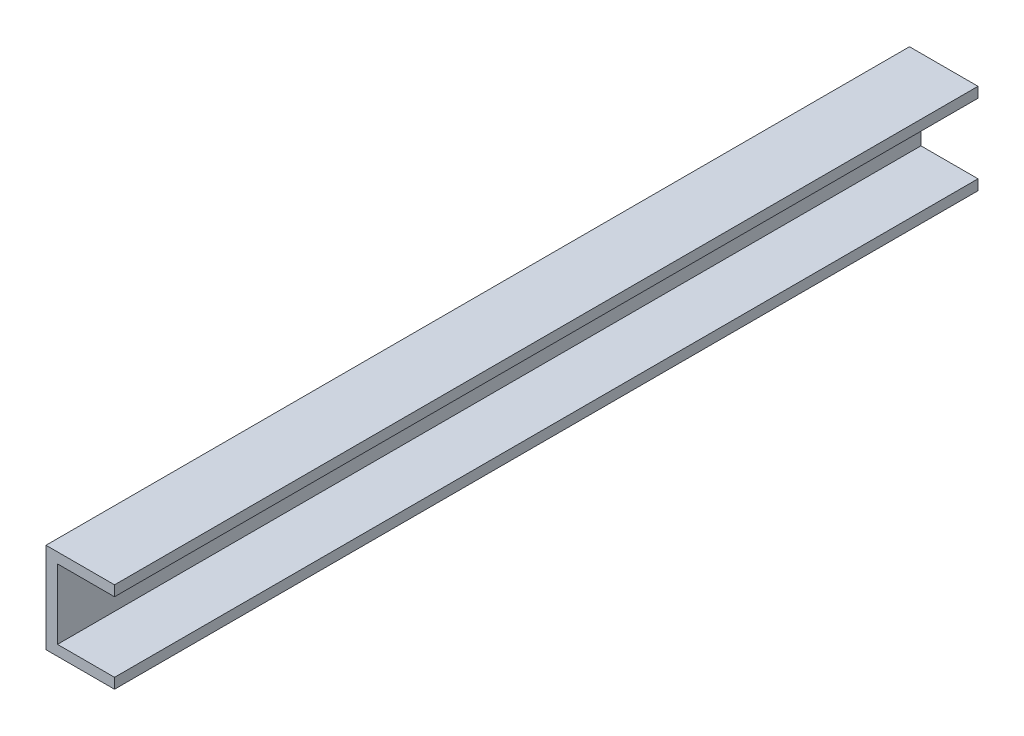
ISO-10303-21;
HEADER;
FILE_DESCRIPTION(('STEP AP214'),'2;1');
FILE_NAME('part.step','',(''),(''),'','','');
FILE_SCHEMA(('AUTOMOTIVE_DESIGN { 1 0 10303 214 1 1 1 1 }'));
ENDSEC;
DATA;
#1=APPLICATION_CONTEXT('core data for automotive mechanical design processes');
#2=APPLICATION_PROTOCOL_DEFINITION('international standard','automotive_design',2000,#1);
#3=PRODUCT_CONTEXT('',#1,'mechanical');
#4=PRODUCT('Part','Part','',(#3));
#5=PRODUCT_RELATED_PRODUCT_CATEGORY('part','',(#4));
#6=PRODUCT_DEFINITION_FORMATION('','',#4);
#7=PRODUCT_DEFINITION_CONTEXT('part definition',#1,'design');
#8=PRODUCT_DEFINITION('design','',#6,#7);
#9=PRODUCT_DEFINITION_SHAPE('','',#8);
#10=(LENGTH_UNIT() NAMED_UNIT(*) SI_UNIT(.MILLI.,.METRE.));
#11=(NAMED_UNIT(*) PLANE_ANGLE_UNIT() SI_UNIT($,.RADIAN.));
#12=(NAMED_UNIT(*) SI_UNIT($,.STERADIAN.) SOLID_ANGLE_UNIT());
#13=UNCERTAINTY_MEASURE_WITH_UNIT(LENGTH_MEASURE(1.E-05),#10,'distance_accuracy_value','');
#14=(GEOMETRIC_REPRESENTATION_CONTEXT(3) GLOBAL_UNCERTAINTY_ASSIGNED_CONTEXT((#13)) GLOBAL_UNIT_ASSIGNED_CONTEXT((#10,
#11,#12)) REPRESENTATION_CONTEXT('',''));
#15=CARTESIAN_POINT('',(0.,0.,0.));
#16=DIRECTION('',(0.,0.,1.));
#17=DIRECTION('',(1.,0.,0.));
#18=AXIS2_PLACEMENT_3D('',#15,#16,#17);
#19=CARTESIAN_POINT('',(53.0171572846732,35.,668.02));
#20=DIRECTION('',(0.,-1.,0.));
#21=DIRECTION('',(1.,0.,0.));
#22=AXIS2_PLACEMENT_3D('',#19,#20,#21);
#23=PLANE('',#22);
#24=DIRECTION('',(-1.,0.,0.));
#25=VECTOR('',#24,1.);
#26=CARTESIAN_POINT('',(53.0171572846732,35.,0.));
#27=LINE('',#26,#25);
#28=CARTESIAN_POINT('',(53.0171572846732,35.,0.));
#29=VERTEX_POINT('',#28);
#30=CARTESIAN_POINT('',(0.,35.,0.));
#31=VERTEX_POINT('',#30);
#32=EDGE_CURVE('E129',#29,#31,#27,.T.);
#33=ORIENTED_EDGE('',*,*,#32,.T.);
#34=DIRECTION('',(0.,0.,-1.));
#35=VECTOR('',#34,1.);
#36=CARTESIAN_POINT('',(0.,35.,668.02));
#37=LINE('',#36,#35);
#38=CARTESIAN_POINT('',(0.,35.,668.02));
#39=VERTEX_POINT('',#38);
#40=EDGE_CURVE('E11',#39,#31,#37,.T.);
#41=ORIENTED_EDGE('',*,*,#40,.F.);
#42=DIRECTION('',(-1.,0.,0.));
#43=VECTOR('',#42,1.);
#44=CARTESIAN_POINT('',(53.0171572846732,35.,668.02));
#45=LINE('',#44,#43);
#46=CARTESIAN_POINT('',(53.0171572846732,35.,668.02));
#47=VERTEX_POINT('',#46);
#48=EDGE_CURVE('E143',#47,#39,#45,.T.);
#49=ORIENTED_EDGE('',*,*,#48,.F.);
#50=DIRECTION('',(0.,0.,-1.));
#51=VECTOR('',#50,1.);
#52=CARTESIAN_POINT('',(53.0171572846732,35.,668.02));
#53=LINE('',#52,#51);
#54=EDGE_CURVE('E125',#47,#29,#53,.T.);
#55=ORIENTED_EDGE('',*,*,#54,.T.);
#56=EDGE_LOOP('',(#33,#41,#49,#55));
#57=FACE_BOUND('',#56,.T.);
#58=ADVANCED_FACE('F33',(#57),#23,.F.);
#59=CARTESIAN_POINT('',(0.,35.,668.02));
#60=DIRECTION('',(1.,0.,0.));
#61=DIRECTION('',(0.,1.,0.));
#62=AXIS2_PLACEMENT_3D('',#59,#60,#61);
#63=PLANE('',#62);
#64=DIRECTION('',(0.,-1.,0.));
#65=VECTOR('',#64,1.);
#66=CARTESIAN_POINT('',(0.,35.,0.));
#67=LINE('',#66,#65);
#68=CARTESIAN_POINT('',(0.,-35.,0.));
#69=VERTEX_POINT('',#68);
#70=EDGE_CURVE('E132',#31,#69,#67,.T.);
#71=ORIENTED_EDGE('',*,*,#70,.T.);
#72=DIRECTION('',(0.,0.,-1.));
#73=VECTOR('',#72,1.);
#74=CARTESIAN_POINT('',(0.,-35.,668.02));
#75=LINE('',#74,#73);
#76=CARTESIAN_POINT('',(0.,-35.,668.02));
#77=VERTEX_POINT('',#76);
#78=EDGE_CURVE('E41',#77,#69,#75,.T.);
#79=ORIENTED_EDGE('',*,*,#78,.F.);
#80=DIRECTION('',(0.,-1.,0.));
#81=VECTOR('',#80,1.);
#82=CARTESIAN_POINT('',(0.,35.,668.02));
#83=LINE('',#82,#81);
#84=EDGE_CURVE('E92',#39,#77,#83,.T.);
#85=ORIENTED_EDGE('',*,*,#84,.F.);
#86=ORIENTED_EDGE('',*,*,#40,.T.);
#87=EDGE_LOOP('',(#71,#79,#85,#86));
#88=FACE_BOUND('',#87,.T.);
#89=ADVANCED_FACE('F178',(#88),#63,.F.);
#90=CARTESIAN_POINT('',(0.,-35.,668.02));
#91=DIRECTION('',(0.,1.,0.));
#92=DIRECTION('',(0.,0.,1.));
#93=AXIS2_PLACEMENT_3D('',#90,#91,#92);
#94=PLANE('',#93);
#95=DIRECTION('',(1.,0.,0.));
#96=VECTOR('',#95,1.);
#97=CARTESIAN_POINT('',(0.,-35.,0.));
#98=LINE('',#97,#96);
#99=CARTESIAN_POINT('',(53.0171572846732,-35.,0.));
#100=VERTEX_POINT('',#99);
#101=EDGE_CURVE('E134',#69,#100,#98,.T.);
#102=ORIENTED_EDGE('',*,*,#101,.T.);
#103=DIRECTION('',(0.,0.,-1.));
#104=VECTOR('',#103,1.);
#105=CARTESIAN_POINT('',(53.0171572846732,-35.,668.02));
#106=LINE('',#105,#104);
#107=CARTESIAN_POINT('',(53.0171572846732,-35.,668.02));
#108=VERTEX_POINT('',#107);
#109=EDGE_CURVE('E150',#108,#100,#106,.T.);
#110=ORIENTED_EDGE('',*,*,#109,.F.);
#111=DIRECTION('',(1.,0.,0.));
#112=VECTOR('',#111,1.);
#113=CARTESIAN_POINT('',(0.,-35.,668.02));
#114=LINE('',#113,#112);
#115=EDGE_CURVE('E158',#77,#108,#114,.T.);
#116=ORIENTED_EDGE('',*,*,#115,.F.);
#117=ORIENTED_EDGE('',*,*,#78,.T.);
#118=EDGE_LOOP('',(#102,#110,#116,#117));
#119=FACE_BOUND('',#118,.T.);
#120=ADVANCED_FACE('F156',(#119),#94,.F.);
#121=CARTESIAN_POINT('',(53.0171572846732,-35.,668.02));
#122=DIRECTION('',(-1.,0.,0.));
#123=DIRECTION('',(0.,0.,1.));
#124=AXIS2_PLACEMENT_3D('',#121,#122,#123);
#125=PLANE('',#124);
#126=DIRECTION('',(0.,1.,0.));
#127=VECTOR('',#126,1.);
#128=CARTESIAN_POINT('',(53.0171572846732,-35.,0.));
#129=LINE('',#128,#127);
#130=CARTESIAN_POINT('',(53.0171572846732,-26.9745222929937,0.));
#131=VERTEX_POINT('',#130);
#132=EDGE_CURVE('E136',#100,#131,#129,.T.);
#133=ORIENTED_EDGE('',*,*,#132,.T.);
#134=DIRECTION('',(0.,0.,-1.));
#135=VECTOR('',#134,1.);
#136=CARTESIAN_POINT('',(53.0171572846732,-26.9745222929937,668.02));
#137=LINE('',#136,#135);
#138=CARTESIAN_POINT('',(53.0171572846732,-26.9745222929937,668.02));
#139=VERTEX_POINT('',#138);
#140=EDGE_CURVE('E147',#139,#131,#137,.T.);
#141=ORIENTED_EDGE('',*,*,#140,.F.);
#142=DIRECTION('',(0.,1.,0.));
#143=VECTOR('',#142,1.);
#144=CARTESIAN_POINT('',(53.0171572846732,-35.,668.02));
#145=LINE('',#144,#143);
#146=EDGE_CURVE('E170',#108,#139,#145,.T.);
#147=ORIENTED_EDGE('',*,*,#146,.F.);
#148=ORIENTED_EDGE('',*,*,#109,.T.);
#149=EDGE_LOOP('',(#133,#141,#147,#148));
#150=FACE_BOUND('',#149,.T.);
#151=ADVANCED_FACE('F166',(#150),#125,.F.);
#152=CARTESIAN_POINT('',(53.0171572846732,-26.9745222929937,668.02));
#153=DIRECTION('',(0.,-1.,0.));
#154=DIRECTION('',(0.,0.,-1.));
#155=AXIS2_PLACEMENT_3D('',#152,#153,#154);
#156=PLANE('',#155);
#157=DIRECTION('',(-1.,0.,0.));
#158=VECTOR('',#157,1.);
#159=CARTESIAN_POINT('',(53.0171572846732,-26.9745222929937,0.));
#160=LINE('',#159,#158);
#161=CARTESIAN_POINT('',(8.87702989613813,-26.9745222929937,0.));
#162=VERTEX_POINT('',#161);
#163=EDGE_CURVE('E138',#131,#162,#160,.T.);
#164=ORIENTED_EDGE('',*,*,#163,.T.);
#165=DIRECTION('',(0.,0.,-1.));
#166=VECTOR('',#165,1.);
#167=CARTESIAN_POINT('',(8.87702989613813,-26.9745222929937,668.02));
#168=LINE('',#167,#166);
#169=CARTESIAN_POINT('',(8.87702989613813,-26.9745222929937,668.02));
#170=VERTEX_POINT('',#169);
#171=EDGE_CURVE('E120',#170,#162,#168,.T.);
#172=ORIENTED_EDGE('',*,*,#171,.F.);
#173=DIRECTION('',(-1.,0.,0.));
#174=VECTOR('',#173,1.);
#175=CARTESIAN_POINT('',(53.0171572846732,-26.9745222929937,668.02));
#176=LINE('',#175,#174);
#177=EDGE_CURVE('E111',#139,#170,#176,.T.);
#178=ORIENTED_EDGE('',*,*,#177,.F.);
#179=ORIENTED_EDGE('',*,*,#140,.T.);
#180=EDGE_LOOP('',(#164,#172,#178,#179));
#181=FACE_BOUND('',#180,.T.);
#182=ADVANCED_FACE('F169',(#181),#156,.F.);
#183=CARTESIAN_POINT('',(8.87702989613813,-26.9745222929937,668.02));
#184=DIRECTION('',(-1.,0.,0.));
#185=DIRECTION('',(0.,0.,1.));
#186=AXIS2_PLACEMENT_3D('',#183,#184,#185);
#187=PLANE('',#186);
#188=DIRECTION('',(0.,1.,0.));
#189=VECTOR('',#188,1.);
#190=CARTESIAN_POINT('',(8.87702989613813,-26.9745222929937,0.));
#191=LINE('',#190,#189);
#192=CARTESIAN_POINT('',(8.87702989613813,26.9745222929937,0.));
#193=VERTEX_POINT('',#192);
#194=EDGE_CURVE('E119',#162,#193,#191,.T.);
#195=ORIENTED_EDGE('',*,*,#194,.T.);
#196=DIRECTION('',(0.,0.,-1.));
#197=VECTOR('',#196,1.);
#198=CARTESIAN_POINT('',(8.87702989613813,26.9745222929937,668.02));
#199=LINE('',#198,#197);
#200=CARTESIAN_POINT('',(8.87702989613813,26.9745222929937,668.02));
#201=VERTEX_POINT('',#200);
#202=EDGE_CURVE('E116',#201,#193,#199,.T.);
#203=ORIENTED_EDGE('',*,*,#202,.F.);
#204=DIRECTION('',(0.,1.,0.));
#205=VECTOR('',#204,1.);
#206=CARTESIAN_POINT('',(8.87702989613813,-26.9745222929937,668.02));
#207=LINE('',#206,#205);
#208=EDGE_CURVE('E105',#170,#201,#207,.T.);
#209=ORIENTED_EDGE('',*,*,#208,.F.);
#210=ORIENTED_EDGE('',*,*,#171,.T.);
#211=EDGE_LOOP('',(#195,#203,#209,#210));
#212=FACE_BOUND('',#211,.T.);
#213=ADVANCED_FACE('F117',(#212),#187,.F.);
#214=CARTESIAN_POINT('',(8.87702989613813,26.9745222929937,668.02));
#215=DIRECTION('',(0.,1.,0.));
#216=DIRECTION('',(0.,0.,1.));
#217=AXIS2_PLACEMENT_3D('',#214,#215,#216);
#218=PLANE('',#217);
#219=DIRECTION('',(1.,0.,0.));
#220=VECTOR('',#219,1.);
#221=CARTESIAN_POINT('',(8.87702989613813,26.9745222929937,0.));
#222=LINE('',#221,#220);
#223=CARTESIAN_POINT('',(53.0171572846732,26.9745222929937,0.));
#224=VERTEX_POINT('',#223);
#225=EDGE_CURVE('E78',#193,#224,#222,.T.);
#226=ORIENTED_EDGE('',*,*,#225,.T.);
#227=DIRECTION('',(0.,0.,-1.));
#228=VECTOR('',#227,1.);
#229=CARTESIAN_POINT('',(53.0171572846732,26.9745222929937,668.02));
#230=LINE('',#229,#228);
#231=CARTESIAN_POINT('',(53.0171572846732,26.9745222929937,668.02));
#232=VERTEX_POINT('',#231);
#233=EDGE_CURVE('E121',#232,#224,#230,.T.);
#234=ORIENTED_EDGE('',*,*,#233,.F.);
#235=DIRECTION('',(1.,0.,0.));
#236=VECTOR('',#235,1.);
#237=CARTESIAN_POINT('',(8.87702989613813,26.9745222929937,668.02));
#238=LINE('',#237,#236);
#239=EDGE_CURVE('E109',#201,#232,#238,.T.);
#240=ORIENTED_EDGE('',*,*,#239,.F.);
#241=ORIENTED_EDGE('',*,*,#202,.T.);
#242=EDGE_LOOP('',(#226,#234,#240,#241));
#243=FACE_BOUND('',#242,.T.);
#244=ADVANCED_FACE('F123',(#243),#218,.F.);
#245=CARTESIAN_POINT('',(53.0171572846732,26.9745222929937,668.02));
#246=DIRECTION('',(-1.,0.,0.));
#247=DIRECTION('',(0.,0.,1.));
#248=AXIS2_PLACEMENT_3D('',#245,#246,#247);
#249=PLANE('',#248);
#250=DIRECTION('',(0.,1.,0.));
#251=VECTOR('',#250,1.);
#252=CARTESIAN_POINT('',(53.0171572846732,26.9745222929937,0.));
#253=LINE('',#252,#251);
#254=EDGE_CURVE('E84',#224,#29,#253,.T.);
#255=ORIENTED_EDGE('',*,*,#254,.T.);
#256=ORIENTED_EDGE('',*,*,#54,.F.);
#257=DIRECTION('',(0.,1.,0.));
#258=VECTOR('',#257,1.);
#259=CARTESIAN_POINT('',(53.0171572846732,26.9745222929937,668.02));
#260=LINE('',#259,#258);
#261=EDGE_CURVE('E49',#232,#47,#260,.T.);
#262=ORIENTED_EDGE('',*,*,#261,.F.);
#263=ORIENTED_EDGE('',*,*,#233,.T.);
#264=EDGE_LOOP('',(#255,#256,#262,#263));
#265=FACE_BOUND('',#264,.T.);
#266=ADVANCED_FACE('F194',(#265),#249,.F.);
#267=CARTESIAN_POINT('',(0.,0.,668.02));
#268=DIRECTION('',(0.,0.,1.));
#269=DIRECTION('',(1.,0.,0.));
#270=AXIS2_PLACEMENT_3D('',#267,#268,#269);
#271=PLANE('',#270);
#272=ORIENTED_EDGE('',*,*,#48,.T.);
#273=ORIENTED_EDGE('',*,*,#84,.T.);
#274=ORIENTED_EDGE('',*,*,#115,.T.);
#275=ORIENTED_EDGE('',*,*,#146,.T.);
#276=ORIENTED_EDGE('',*,*,#177,.T.);
#277=ORIENTED_EDGE('',*,*,#208,.T.);
#278=ORIENTED_EDGE('',*,*,#239,.T.);
#279=ORIENTED_EDGE('',*,*,#261,.T.);
#280=EDGE_LOOP('',(#272,#273,#274,#275,#276,#277,#278,#279));
#281=FACE_BOUND('',#280,.T.);
#282=ADVANCED_FACE('F107',(#281),#271,.T.);
#283=CARTESIAN_POINT('',(0.,0.,0.));
#284=DIRECTION('',(0.,0.,1.));
#285=DIRECTION('',(1.,0.,0.));
#286=AXIS2_PLACEMENT_3D('',#283,#284,#285);
#287=PLANE('',#286);
#288=ORIENTED_EDGE('',*,*,#32,.F.);
#289=ORIENTED_EDGE('',*,*,#254,.F.);
#290=ORIENTED_EDGE('',*,*,#225,.F.);
#291=ORIENTED_EDGE('',*,*,#194,.F.);
#292=ORIENTED_EDGE('',*,*,#163,.F.);
#293=ORIENTED_EDGE('',*,*,#132,.F.);
#294=ORIENTED_EDGE('',*,*,#101,.F.);
#295=ORIENTED_EDGE('',*,*,#70,.F.);
#296=EDGE_LOOP('',(#288,#289,#290,#291,#292,#293,#294,#295));
#297=FACE_BOUND('',#296,.T.);
#298=ADVANCED_FACE('F162',(#297),#287,.F.);
#299=CLOSED_SHELL('',(#58,#89,#120,#151,#182,#213,#244,#266,#282,#298));
#300=MANIFOLD_SOLID_BREP('B2',#299);
#301=ADVANCED_BREP_SHAPE_REPRESENTATION('',(#18,#300),#14);
#302=SHAPE_DEFINITION_REPRESENTATION(#9,#301);
ENDSEC;
END-ISO-10303-21;
